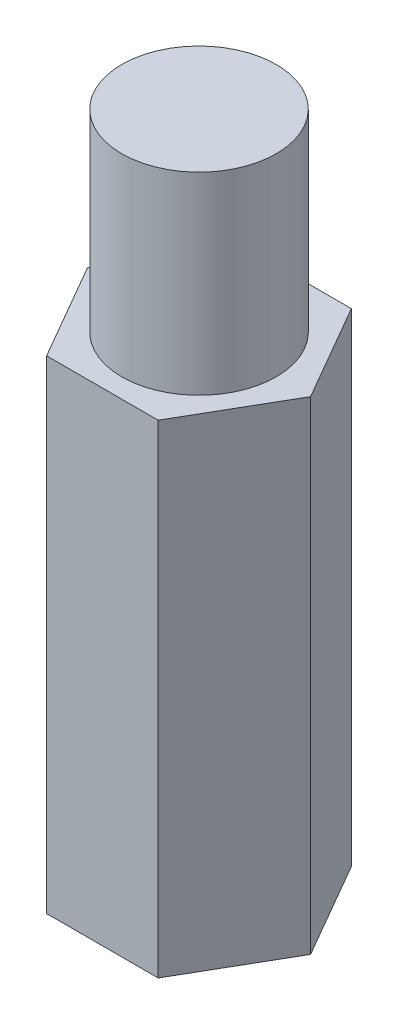
ISO-10303-21;
HEADER;
FILE_DESCRIPTION(('STEP AP214'),'2;1');
FILE_NAME('part.step','',(''),(''),'','','');
FILE_SCHEMA(('AUTOMOTIVE_DESIGN { 1 0 10303 214 1 1 1 1 }'));
ENDSEC;
DATA;
#1=APPLICATION_CONTEXT('core data for automotive mechanical design processes');
#2=APPLICATION_PROTOCOL_DEFINITION('international standard','automotive_design',2000,#1);
#3=PRODUCT_CONTEXT('',#1,'mechanical');
#4=PRODUCT('Part','Part','',(#3));
#5=PRODUCT_RELATED_PRODUCT_CATEGORY('part','',(#4));
#6=PRODUCT_DEFINITION_FORMATION('','',#4);
#7=PRODUCT_DEFINITION_CONTEXT('part definition',#1,'design');
#8=PRODUCT_DEFINITION('design','',#6,#7);
#9=PRODUCT_DEFINITION_SHAPE('','',#8);
#10=(LENGTH_UNIT() NAMED_UNIT(*) SI_UNIT(.MILLI.,.METRE.));
#11=(NAMED_UNIT(*) PLANE_ANGLE_UNIT() SI_UNIT($,.RADIAN.));
#12=(NAMED_UNIT(*) SI_UNIT($,.STERADIAN.) SOLID_ANGLE_UNIT());
#13=UNCERTAINTY_MEASURE_WITH_UNIT(LENGTH_MEASURE(1.E-05),#10,'distance_accuracy_value','');
#14=(GEOMETRIC_REPRESENTATION_CONTEXT(3) GLOBAL_UNCERTAINTY_ASSIGNED_CONTEXT((#13)) GLOBAL_UNIT_ASSIGNED_CONTEXT((#10,
#11,#12)) REPRESENTATION_CONTEXT('',''));
#15=CARTESIAN_POINT('',(0.,0.,0.));
#16=DIRECTION('',(0.,0.,1.));
#17=DIRECTION('',(1.,0.,0.));
#18=AXIS2_PLACEMENT_3D('',#15,#16,#17);
#19=CARTESIAN_POINT('',(1.15470053837928,10.,1.99999999999999));
#20=DIRECTION('',(-0.866025403784442,0.,-0.499999999999995));
#21=DIRECTION('',(-0.499999999999995,0.,0.866025403784442));
#22=AXIS2_PLACEMENT_3D('',#19,#20,#21);
#23=PLANE('',#22);
#24=DIRECTION('',(0.499999999999995,0.,-0.866025403784442));
#25=VECTOR('',#24,1.);
#26=CARTESIAN_POINT('',(1.15470053837928,0.,1.99999999999999));
#27=LINE('',#26,#25);
#28=CARTESIAN_POINT('',(1.15470053837928,0.,1.99999999999999));
#29=VERTEX_POINT('',#28);
#30=CARTESIAN_POINT('',(2.3094010767585,0.,0.));
#31=VERTEX_POINT('',#30);
#32=EDGE_CURVE('E130',#29,#31,#27,.T.);
#33=ORIENTED_EDGE('',*,*,#32,.T.);
#34=DIRECTION('',(0.,-1.,0.));
#35=VECTOR('',#34,1.);
#36=CARTESIAN_POINT('',(2.3094010767585,10.,0.));
#37=LINE('',#36,#35);
#38=CARTESIAN_POINT('',(2.3094010767585,10.,0.));
#39=VERTEX_POINT('',#38);
#40=EDGE_CURVE('E42',#39,#31,#37,.T.);
#41=ORIENTED_EDGE('',*,*,#40,.F.);
#42=DIRECTION('',(0.499999999999995,0.,-0.866025403784442));
#43=VECTOR('',#42,1.);
#44=CARTESIAN_POINT('',(1.15470053837928,10.,1.99999999999999));
#45=LINE('',#44,#43);
#46=CARTESIAN_POINT('',(1.15470053837928,10.,1.99999999999999));
#47=VERTEX_POINT('',#46);
#48=EDGE_CURVE('E147',#47,#39,#45,.T.);
#49=ORIENTED_EDGE('',*,*,#48,.F.);
#50=DIRECTION('',(0.,-1.,0.));
#51=VECTOR('',#50,1.);
#52=CARTESIAN_POINT('',(1.15470053837928,10.,1.99999999999999));
#53=LINE('',#52,#51);
#54=EDGE_CURVE('E126',#47,#29,#53,.T.);
#55=ORIENTED_EDGE('',*,*,#54,.T.);
#56=EDGE_LOOP('',(#33,#41,#49,#55));
#57=FACE_BOUND('',#56,.T.);
#58=ADVANCED_FACE('F39',(#57),#23,.F.);
#59=CARTESIAN_POINT('',(2.3094010767585,10.,0.));
#60=DIRECTION('',(-0.866025403784438,0.,0.500000000000001));
#61=DIRECTION('',(0.500000000000001,0.,0.866025403784438));
#62=AXIS2_PLACEMENT_3D('',#59,#60,#61);
#63=PLANE('',#62);
#64=DIRECTION('',(-0.500000000000001,0.,-0.866025403784438));
#65=VECTOR('',#64,1.);
#66=CARTESIAN_POINT('',(2.3094010767585,0.,0.));
#67=LINE('',#66,#65);
#68=CARTESIAN_POINT('',(1.15470053837925,0.,-2.));
#69=VERTEX_POINT('',#68);
#70=EDGE_CURVE('E134',#31,#69,#67,.T.);
#71=ORIENTED_EDGE('',*,*,#70,.T.);
#72=DIRECTION('',(0.,-1.,0.));
#73=VECTOR('',#72,1.);
#74=CARTESIAN_POINT('',(1.15470053837925,10.,-2.));
#75=LINE('',#74,#73);
#76=CARTESIAN_POINT('',(1.15470053837925,10.,-2.));
#77=VERTEX_POINT('',#76);
#78=EDGE_CURVE('E153',#77,#69,#75,.T.);
#79=ORIENTED_EDGE('',*,*,#78,.F.);
#80=DIRECTION('',(-0.500000000000001,0.,-0.866025403784438));
#81=VECTOR('',#80,1.);
#82=CARTESIAN_POINT('',(2.3094010767585,10.,0.));
#83=LINE('',#82,#81);
#84=EDGE_CURVE('E95',#39,#77,#83,.T.);
#85=ORIENTED_EDGE('',*,*,#84,.F.);
#86=ORIENTED_EDGE('',*,*,#40,.T.);
#87=EDGE_LOOP('',(#71,#79,#85,#86));
#88=FACE_BOUND('',#87,.T.);
#89=ADVANCED_FACE('F160',(#88),#63,.F.);
#90=CARTESIAN_POINT('',(1.15470053837925,10.,-2.));
#91=DIRECTION('',(0.,0.,1.));
#92=DIRECTION('',(1.,0.,0.));
#93=AXIS2_PLACEMENT_3D('',#90,#91,#92);
#94=PLANE('',#93);
#95=DIRECTION('',(-1.,0.,0.));
#96=VECTOR('',#95,1.);
#97=CARTESIAN_POINT('',(1.15470053837925,0.,-2.));
#98=LINE('',#97,#96);
#99=CARTESIAN_POINT('',(-1.15470053837926,0.,-2.));
#100=VERTEX_POINT('',#99);
#101=EDGE_CURVE('E138',#69,#100,#98,.T.);
#102=ORIENTED_EDGE('',*,*,#101,.T.);
#103=DIRECTION('',(0.,-1.,0.));
#104=VECTOR('',#103,1.);
#105=CARTESIAN_POINT('',(-1.15470053837926,10.,-2.));
#106=LINE('',#105,#104);
#107=CARTESIAN_POINT('',(-1.15470053837926,10.,-2.));
#108=VERTEX_POINT('',#107);
#109=EDGE_CURVE('E119',#108,#100,#106,.T.);
#110=ORIENTED_EDGE('',*,*,#109,.F.);
#111=DIRECTION('',(-1.,0.,0.));
#112=VECTOR('',#111,1.);
#113=CARTESIAN_POINT('',(1.15470053837925,10.,-2.));
#114=LINE('',#113,#112);
#115=EDGE_CURVE('E108',#77,#108,#114,.T.);
#116=ORIENTED_EDGE('',*,*,#115,.F.);
#117=ORIENTED_EDGE('',*,*,#78,.T.);
#118=EDGE_LOOP('',(#102,#110,#116,#117));
#119=FACE_BOUND('',#118,.T.);
#120=ADVANCED_FACE('F166',(#119),#94,.F.);
#121=CARTESIAN_POINT('',(-1.15470053837926,10.,-2.));
#122=DIRECTION('',(0.866025403784442,0.,0.499999999999995));
#123=DIRECTION('',(0.499999999999995,0.,-0.866025403784442));
#124=AXIS2_PLACEMENT_3D('',#121,#122,#123);
#125=PLANE('',#124);
#126=DIRECTION('',(-0.499999999999995,0.,0.866025403784441));
#127=VECTOR('',#126,1.);
#128=CARTESIAN_POINT('',(-1.15470053837926,0.,-2.));
#129=LINE('',#128,#127);
#130=CARTESIAN_POINT('',(-2.3094010767585,0.,0.));
#131=VERTEX_POINT('',#130);
#132=EDGE_CURVE('E117',#100,#131,#129,.T.);
#133=ORIENTED_EDGE('',*,*,#132,.T.);
#134=DIRECTION('',(0.,-1.,0.));
#135=VECTOR('',#134,1.);
#136=CARTESIAN_POINT('',(-2.3094010767585,10.,0.));
#137=LINE('',#136,#135);
#138=CARTESIAN_POINT('',(-2.3094010767585,10.,0.));
#139=VERTEX_POINT('',#138);
#140=EDGE_CURVE('E114',#139,#131,#137,.T.);
#141=ORIENTED_EDGE('',*,*,#140,.F.);
#142=DIRECTION('',(-0.499999999999995,0.,0.866025403784441));
#143=VECTOR('',#142,1.);
#144=CARTESIAN_POINT('',(-1.15470053837926,10.,-2.));
#145=LINE('',#144,#143);
#146=EDGE_CURVE('E102',#108,#139,#145,.T.);
#147=ORIENTED_EDGE('',*,*,#146,.F.);
#148=ORIENTED_EDGE('',*,*,#109,.T.);
#149=EDGE_LOOP('',(#133,#141,#147,#148));
#150=FACE_BOUND('',#149,.T.);
#151=ADVANCED_FACE('F115',(#150),#125,.F.);
#152=CARTESIAN_POINT('',(-2.3094010767585,10.,0.));
#153=DIRECTION('',(0.866025403784434,0.,-0.500000000000007));
#154=DIRECTION('',(-0.500000000000007,0.,-0.866025403784435));
#155=AXIS2_PLACEMENT_3D('',#152,#153,#154);
#156=PLANE('',#155);
#157=DIRECTION('',(0.500000000000007,0.,0.866025403784434));
#158=VECTOR('',#157,1.);
#159=CARTESIAN_POINT('',(-2.3094010767585,0.,0.));
#160=LINE('',#159,#158);
#161=CARTESIAN_POINT('',(-1.15470053837923,0.,2.00000000000001));
#162=VERTEX_POINT('',#161);
#163=EDGE_CURVE('E80',#131,#162,#160,.T.);
#164=ORIENTED_EDGE('',*,*,#163,.T.);
#165=DIRECTION('',(0.,-1.,0.));
#166=VECTOR('',#165,1.);
#167=CARTESIAN_POINT('',(-1.15470053837923,10.,2.00000000000001));
#168=LINE('',#167,#166);
#169=CARTESIAN_POINT('',(-1.15470053837923,10.,2.00000000000001));
#170=VERTEX_POINT('',#169);
#171=EDGE_CURVE('E120',#170,#162,#168,.T.);
#172=ORIENTED_EDGE('',*,*,#171,.F.);
#173=DIRECTION('',(0.500000000000007,0.,0.866025403784434));
#174=VECTOR('',#173,1.);
#175=CARTESIAN_POINT('',(-2.3094010767585,10.,0.));
#176=LINE('',#175,#174);
#177=EDGE_CURVE('E106',#139,#170,#176,.T.);
#178=ORIENTED_EDGE('',*,*,#177,.F.);
#179=ORIENTED_EDGE('',*,*,#140,.T.);
#180=EDGE_LOOP('',(#164,#172,#178,#179));
#181=FACE_BOUND('',#180,.T.);
#182=ADVANCED_FACE('F122',(#181),#156,.F.);
#183=CARTESIAN_POINT('',(-1.15470053837923,10.,2.00000000000001));
#184=DIRECTION('',(0.,0.,-1.));
#185=DIRECTION('',(-1.,0.,0.));
#186=AXIS2_PLACEMENT_3D('',#183,#184,#185);
#187=PLANE('',#186);
#188=DIRECTION('',(1.,0.,0.));
#189=VECTOR('',#188,1.);
#190=CARTESIAN_POINT('',(-1.15470053837923,0.,2.00000000000001));
#191=LINE('',#190,#189);
#192=EDGE_CURVE('E86',#162,#29,#191,.T.);
#193=ORIENTED_EDGE('',*,*,#192,.T.);
#194=ORIENTED_EDGE('',*,*,#54,.F.);
#195=DIRECTION('',(1.,0.,0.));
#196=VECTOR('',#195,1.);
#197=CARTESIAN_POINT('',(-1.15470053837923,10.,2.00000000000001));
#198=LINE('',#197,#196);
#199=EDGE_CURVE('E57',#170,#47,#198,.T.);
#200=ORIENTED_EDGE('',*,*,#199,.F.);
#201=ORIENTED_EDGE('',*,*,#171,.T.);
#202=EDGE_LOOP('',(#193,#194,#200,#201));
#203=FACE_BOUND('',#202,.T.);
#204=ADVANCED_FACE('F203',(#203),#187,.F.);
#205=CARTESIAN_POINT('',(0.,10.,0.));
#206=DIRECTION('',(0.,1.,0.));
#207=DIRECTION('',(0.,0.,1.));
#208=AXIS2_PLACEMENT_3D('',#205,#206,#207);
#209=PLANE('',#208);
#210=CARTESIAN_POINT('',(0.,10.,0.));
#211=DIRECTION('',(0.,1.,0.));
#212=DIRECTION('',(0.,0.,1.));
#213=AXIS2_PLACEMENT_3D('',#210,#211,#212);
#214=CIRCLE('',#213,1.6);
#215=CARTESIAN_POINT('',(0.,10.,1.6));
#216=VERTEX_POINT('',#215);
#217=EDGE_CURVE('E11',#216,#216,#214,.T.);
#218=ORIENTED_EDGE('',*,*,#217,.F.);
#219=EDGE_LOOP('',(#218));
#220=FACE_BOUND('',#219,.T.);
#221=ORIENTED_EDGE('',*,*,#48,.T.);
#222=ORIENTED_EDGE('',*,*,#84,.T.);
#223=ORIENTED_EDGE('',*,*,#115,.T.);
#224=ORIENTED_EDGE('',*,*,#146,.T.);
#225=ORIENTED_EDGE('',*,*,#177,.T.);
#226=ORIENTED_EDGE('',*,*,#199,.T.);
#227=EDGE_LOOP('',(#221,#222,#223,#224,#225,#226));
#228=FACE_BOUND('',#227,.T.);
#229=ADVANCED_FACE('F104',(#220,#228),#209,.T.);
#230=CARTESIAN_POINT('',(0.,0.,0.));
#231=DIRECTION('',(0.,1.,0.));
#232=DIRECTION('',(0.,0.,1.));
#233=AXIS2_PLACEMENT_3D('',#230,#231,#232);
#234=PLANE('',#233);
#235=CARTESIAN_POINT('',(0.,0.,0.));
#236=DIRECTION('',(0.,-1.,0.));
#237=DIRECTION('',(0.,0.,-1.));
#238=AXIS2_PLACEMENT_3D('',#235,#236,#237);
#239=CIRCLE('',#238,1.6);
#240=CARTESIAN_POINT('',(0.,0.,-1.6));
#241=VERTEX_POINT('',#240);
#242=EDGE_CURVE('E177',#241,#241,#239,.T.);
#243=ORIENTED_EDGE('',*,*,#242,.F.);
#244=EDGE_LOOP('',(#243));
#245=FACE_BOUND('',#244,.T.);
#246=ORIENTED_EDGE('',*,*,#32,.F.);
#247=ORIENTED_EDGE('',*,*,#192,.F.);
#248=ORIENTED_EDGE('',*,*,#163,.F.);
#249=ORIENTED_EDGE('',*,*,#132,.F.);
#250=ORIENTED_EDGE('',*,*,#101,.F.);
#251=ORIENTED_EDGE('',*,*,#70,.F.);
#252=EDGE_LOOP('',(#246,#247,#248,#249,#250,#251));
#253=FACE_BOUND('',#252,.T.);
#254=ADVANCED_FACE('F165',(#245,#253),#234,.F.);
#255=CARTESIAN_POINT('',(0.,14.,0.));
#256=DIRECTION('',(0.,-1.,0.));
#257=DIRECTION('',(0.,0.,-1.));
#258=AXIS2_PLACEMENT_3D('',#255,#256,#257);
#259=CYLINDRICAL_SURFACE('',#258,1.6);
#260=CARTESIAN_POINT('',(0.,14.,0.));
#261=DIRECTION('',(0.,1.,0.));
#262=DIRECTION('',(0.,0.,1.));
#263=AXIS2_PLACEMENT_3D('',#260,#261,#262);
#264=CIRCLE('',#263,1.6);
#265=CARTESIAN_POINT('',(0.,14.,1.6));
#266=VERTEX_POINT('',#265);
#267=EDGE_CURVE('E135',#266,#266,#264,.T.);
#268=ORIENTED_EDGE('',*,*,#267,.F.);
#269=EDGE_LOOP('',(#268));
#270=FACE_BOUND('',#269,.T.);
#271=ORIENTED_EDGE('',*,*,#217,.T.);
#272=EDGE_LOOP('',(#271));
#273=FACE_BOUND('',#272,.T.);
#274=ADVANCED_FACE('F195',(#270,#273),#259,.T.);
#275=CARTESIAN_POINT('',(0.,14.,0.));
#276=DIRECTION('',(0.,1.,0.));
#277=DIRECTION('',(0.,0.,1.));
#278=AXIS2_PLACEMENT_3D('',#275,#276,#277);
#279=PLANE('',#278);
#280=ORIENTED_EDGE('',*,*,#267,.T.);
#281=EDGE_LOOP('',(#280));
#282=FACE_BOUND('',#281,.T.);
#283=ADVANCED_FACE('F190',(#282),#279,.T.);
#284=CARTESIAN_POINT('',(0.,4.,0.));
#285=DIRECTION('',(0.,-1.,0.));
#286=DIRECTION('',(0.,0.,-1.));
#287=AXIS2_PLACEMENT_3D('',#284,#285,#286);
#288=CYLINDRICAL_SURFACE('',#287,1.6);
#289=CARTESIAN_POINT('',(0.,4.,0.));
#290=DIRECTION('',(0.,-1.,0.));
#291=DIRECTION('',(0.,0.,-1.));
#292=AXIS2_PLACEMENT_3D('',#289,#290,#291);
#293=CIRCLE('',#292,1.6);
#294=CARTESIAN_POINT('',(0.,4.,-1.6));
#295=VERTEX_POINT('',#294);
#296=EDGE_CURVE('E176',#295,#295,#293,.T.);
#297=ORIENTED_EDGE('',*,*,#296,.F.);
#298=EDGE_LOOP('',(#297));
#299=FACE_BOUND('',#298,.T.);
#300=ORIENTED_EDGE('',*,*,#242,.T.);
#301=EDGE_LOOP('',(#300));
#302=FACE_BOUND('',#301,.T.);
#303=ADVANCED_FACE('F187',(#299,#302),#288,.F.);
#304=CARTESIAN_POINT('',(0.,4.,0.));
#305=DIRECTION('',(0.,-1.,0.));
#306=DIRECTION('',(0.,0.,-1.));
#307=AXIS2_PLACEMENT_3D('',#304,#305,#306);
#308=PLANE('',#307);
#309=ORIENTED_EDGE('',*,*,#296,.T.);
#310=EDGE_LOOP('',(#309));
#311=FACE_BOUND('',#310,.T.);
#312=ADVANCED_FACE('F185',(#311),#308,.T.);
#313=CLOSED_SHELL('',(#58,#89,#120,#151,#182,#204,#229,#254,#274,#283,#303,#312));
#314=MANIFOLD_SOLID_BREP('B2',#313);
#315=ADVANCED_BREP_SHAPE_REPRESENTATION('',(#18,#314),#14);
#316=SHAPE_DEFINITION_REPRESENTATION(#9,#315);
ENDSEC;
END-ISO-10303-21;
